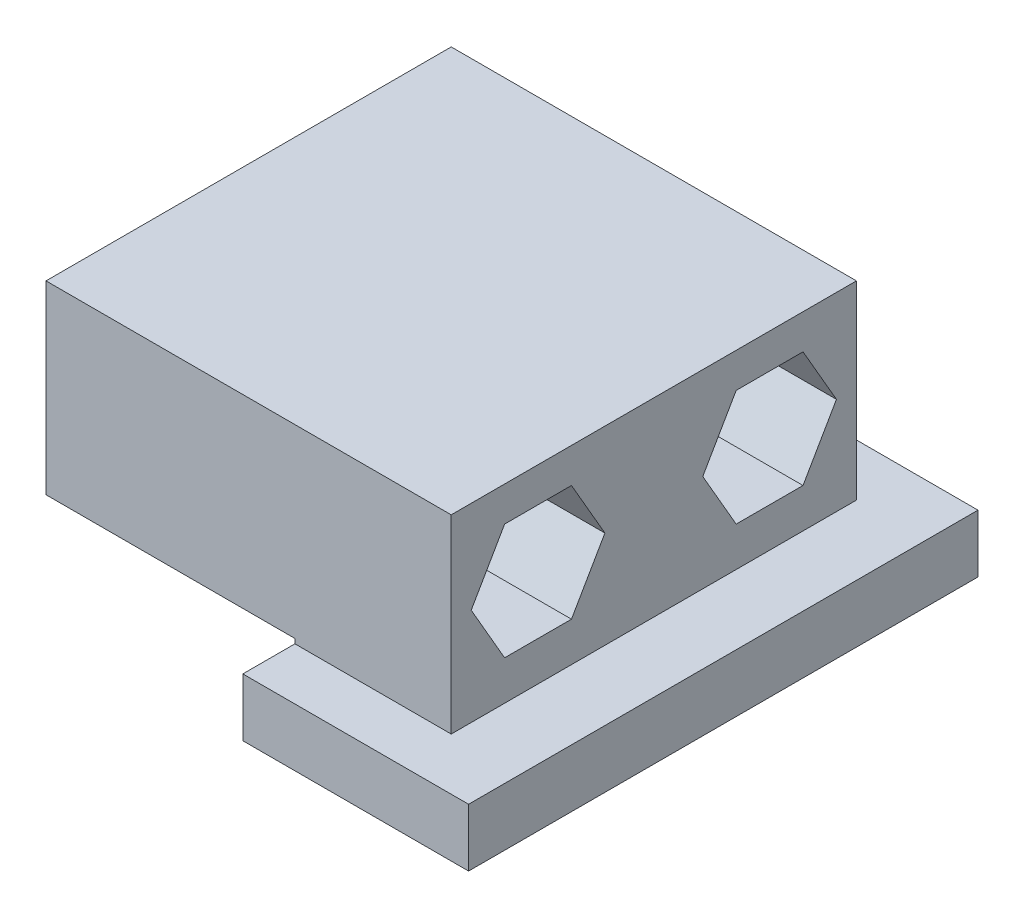
ISO-10303-21;
HEADER;
FILE_DESCRIPTION(('STEP AP214'),'2;1');
FILE_NAME('part.step','',(''),(''),'','','');
FILE_SCHEMA(('AUTOMOTIVE_DESIGN { 1 0 10303 214 1 1 1 1 }'));
ENDSEC;
DATA;
#1=APPLICATION_CONTEXT('core data for automotive mechanical design processes');
#2=APPLICATION_PROTOCOL_DEFINITION('international standard','automotive_design',2000,#1);
#3=PRODUCT_CONTEXT('',#1,'mechanical');
#4=PRODUCT('Part','Part','',(#3));
#5=PRODUCT_RELATED_PRODUCT_CATEGORY('part','',(#4));
#6=PRODUCT_DEFINITION_FORMATION('','',#4);
#7=PRODUCT_DEFINITION_CONTEXT('part definition',#1,'design');
#8=PRODUCT_DEFINITION('design','',#6,#7);
#9=PRODUCT_DEFINITION_SHAPE('','',#8);
#10=(LENGTH_UNIT() NAMED_UNIT(*) SI_UNIT(.MILLI.,.METRE.));
#11=(NAMED_UNIT(*) PLANE_ANGLE_UNIT() SI_UNIT($,.RADIAN.));
#12=(NAMED_UNIT(*) SI_UNIT($,.STERADIAN.) SOLID_ANGLE_UNIT());
#13=UNCERTAINTY_MEASURE_WITH_UNIT(LENGTH_MEASURE(1.E-05),#10,'distance_accuracy_value','');
#14=(GEOMETRIC_REPRESENTATION_CONTEXT(3) GLOBAL_UNCERTAINTY_ASSIGNED_CONTEXT((#13)) GLOBAL_UNIT_ASSIGNED_CONTEXT((#10,
#11,#12)) REPRESENTATION_CONTEXT('',''));
#15=CARTESIAN_POINT('',(0.,0.,0.));
#16=DIRECTION('',(0.,0.,1.));
#17=DIRECTION('',(1.,0.,0.));
#18=AXIS2_PLACEMENT_3D('',#15,#16,#17);
#19=CARTESIAN_POINT('',(-8.75,4.,-5.));
#20=DIRECTION('',(1.,0.,0.));
#21=DIRECTION('',(0.,0.,-1.));
#22=AXIS2_PLACEMENT_3D('',#19,#20,#21);
#23=CYLINDRICAL_SURFACE('',#22,1.35);
#24=CARTESIAN_POINT('',(-8.75,4.,-5.));
#25=DIRECTION('',(1.,0.,0.));
#26=DIRECTION('',(0.,0.,-1.));
#27=AXIS2_PLACEMENT_3D('',#24,#25,#26);
#28=CIRCLE('',#27,1.35);
#29=CARTESIAN_POINT('',(-8.75,4.,-6.35));
#30=VERTEX_POINT('',#29);
#31=EDGE_CURVE('E328',#30,#30,#28,.T.);
#32=ORIENTED_EDGE('',*,*,#31,.F.);
#33=EDGE_LOOP('',(#32));
#34=FACE_BOUND('',#33,.T.);
#35=CARTESIAN_POINT('',(4.75,4.,-5.));
#36=DIRECTION('',(1.,0.,0.));
#37=DIRECTION('',(0.,0.,-1.));
#38=AXIS2_PLACEMENT_3D('',#35,#36,#37);
#39=CIRCLE('',#38,1.35);
#40=CARTESIAN_POINT('',(4.75,4.,-6.35));
#41=VERTEX_POINT('',#40);
#42=EDGE_CURVE('E272',#41,#41,#39,.F.);
#43=ORIENTED_EDGE('',*,*,#42,.F.);
#44=EDGE_LOOP('',(#43));
#45=FACE_BOUND('',#44,.T.);
#46=ADVANCED_FACE('F35',(#34,#45),#23,.F.);
#47=CARTESIAN_POINT('',(8.75,8.,8.75));
#48=DIRECTION('',(-1.,0.,0.));
#49=DIRECTION('',(0.,0.,1.));
#50=AXIS2_PLACEMENT_3D('',#47,#48,#49);
#51=PLANE('',#50);
#52=DIRECTION('',(0.,0.86602540378444,0.499999999999998));
#53=VECTOR('',#52,1.);
#54=CARTESIAN_POINT('',(8.75,3.99999999999999,-7.88675134594813));
#55=LINE('',#54,#53);
#56=CARTESIAN_POINT('',(8.75,3.99999999999999,-7.88675134594813));
#57=VERTEX_POINT('',#56);
#58=CARTESIAN_POINT('',(8.75,6.5,-6.44337567297407));
#59=VERTEX_POINT('',#58);
#60=EDGE_CURVE('E255',#57,#59,#55,.T.);
#61=ORIENTED_EDGE('',*,*,#60,.F.);
#62=DIRECTION('',(0.,0.866025403784439,-0.499999999999999));
#63=VECTOR('',#62,1.);
#64=CARTESIAN_POINT('',(8.75,1.5,-6.44337567297407));
#65=LINE('',#64,#63);
#66=CARTESIAN_POINT('',(8.75,1.5,-6.44337567297407));
#67=VERTEX_POINT('',#66);
#68=EDGE_CURVE('E60',#67,#57,#65,.T.);
#69=ORIENTED_EDGE('',*,*,#68,.F.);
#70=DIRECTION('',(0.,0.,-1.));
#71=VECTOR('',#70,1.);
#72=CARTESIAN_POINT('',(8.75,1.5,-3.55662432702593));
#73=LINE('',#72,#71);
#74=CARTESIAN_POINT('',(8.75,1.5,-3.55662432702593));
#75=VERTEX_POINT('',#74);
#76=EDGE_CURVE('E238',#75,#67,#73,.T.);
#77=ORIENTED_EDGE('',*,*,#76,.F.);
#78=DIRECTION('',(0.,-0.866025403784439,-0.499999999999999));
#79=VECTOR('',#78,1.);
#80=CARTESIAN_POINT('',(8.75,4.,-2.11324865405187));
#81=LINE('',#80,#79);
#82=CARTESIAN_POINT('',(8.75,4.,-2.11324865405187));
#83=VERTEX_POINT('',#82);
#84=EDGE_CURVE('E265',#83,#75,#81,.T.);
#85=ORIENTED_EDGE('',*,*,#84,.F.);
#86=DIRECTION('',(0.,-0.866025403784439,0.5));
#87=VECTOR('',#86,1.);
#88=CARTESIAN_POINT('',(8.75,6.5,-3.55662432702594));
#89=LINE('',#88,#87);
#90=CARTESIAN_POINT('',(8.75,6.5,-3.55662432702594));
#91=VERTEX_POINT('',#90);
#92=EDGE_CURVE('E262',#91,#83,#89,.T.);
#93=ORIENTED_EDGE('',*,*,#92,.F.);
#94=DIRECTION('',(0.,0.,1.));
#95=VECTOR('',#94,1.);
#96=CARTESIAN_POINT('',(8.75,6.5,-6.44337567297407));
#97=LINE('',#96,#95);
#98=EDGE_CURVE('E259',#59,#91,#97,.T.);
#99=ORIENTED_EDGE('',*,*,#98,.F.);
#100=EDGE_LOOP('',(#61,#69,#77,#85,#93,#99));
#101=FACE_BOUND('',#100,.T.);
#102=DIRECTION('',(0.,0.866025403784439,-0.499999999999999));
#103=VECTOR('',#102,1.);
#104=CARTESIAN_POINT('',(8.75,4.,2.11324865405187));
#105=LINE('',#104,#103);
#106=CARTESIAN_POINT('',(8.75,1.5,3.55662432702593));
#107=VERTEX_POINT('',#106);
#108=CARTESIAN_POINT('',(8.75,4.,2.11324865405187));
#109=VERTEX_POINT('',#108);
#110=EDGE_CURVE('E303',#107,#109,#105,.T.);
#111=ORIENTED_EDGE('',*,*,#110,.F.);
#112=DIRECTION('',(0.,0.,-1.));
#113=VECTOR('',#112,1.);
#114=CARTESIAN_POINT('',(8.75,1.5,3.55662432702593));
#115=LINE('',#114,#113);
#116=CARTESIAN_POINT('',(8.75,1.5,6.44337567297407));
#117=VERTEX_POINT('',#116);
#118=EDGE_CURVE('E233',#117,#107,#115,.T.);
#119=ORIENTED_EDGE('',*,*,#118,.F.);
#120=DIRECTION('',(0.,-0.866025403784439,-0.5));
#121=VECTOR('',#120,1.);
#122=CARTESIAN_POINT('',(8.75,1.5,6.44337567297407));
#123=LINE('',#122,#121);
#124=CARTESIAN_POINT('',(8.75,3.99999999999999,7.88675134594813));
#125=VERTEX_POINT('',#124);
#126=EDGE_CURVE('E286',#125,#117,#123,.T.);
#127=ORIENTED_EDGE('',*,*,#126,.F.);
#128=DIRECTION('',(0.,-0.866025403784439,0.499999999999999));
#129=VECTOR('',#128,1.);
#130=CARTESIAN_POINT('',(8.75,3.99999999999999,7.88675134594813));
#131=LINE('',#130,#129);
#132=CARTESIAN_POINT('',(8.75,6.5,6.44337567297406));
#133=VERTEX_POINT('',#132);
#134=EDGE_CURVE('E312',#133,#125,#131,.T.);
#135=ORIENTED_EDGE('',*,*,#134,.F.);
#136=DIRECTION('',(0.,0.,1.));
#137=VECTOR('',#136,1.);
#138=CARTESIAN_POINT('',(8.75,6.5,6.44337567297406));
#139=LINE('',#138,#137);
#140=CARTESIAN_POINT('',(8.75,6.5,3.55662432702593));
#141=VERTEX_POINT('',#140);
#142=EDGE_CURVE('E309',#141,#133,#139,.T.);
#143=ORIENTED_EDGE('',*,*,#142,.F.);
#144=DIRECTION('',(0.,0.866025403784439,0.5));
#145=VECTOR('',#144,1.);
#146=CARTESIAN_POINT('',(8.75,6.5,3.55662432702593));
#147=LINE('',#146,#145);
#148=EDGE_CURVE('E306',#109,#141,#147,.T.);
#149=ORIENTED_EDGE('',*,*,#148,.F.);
#150=EDGE_LOOP('',(#111,#119,#127,#135,#143,#149));
#151=FACE_BOUND('',#150,.T.);
#152=DIRECTION('',(0.,-1.,0.));
#153=VECTOR('',#152,1.);
#154=CARTESIAN_POINT('',(8.75,8.,8.75));
#155=LINE('',#154,#153);
#156=CARTESIAN_POINT('',(8.75,8.,8.75));
#157=VERTEX_POINT('',#156);
#158=CARTESIAN_POINT('',(8.75,-0.2,8.75));
#159=VERTEX_POINT('',#158);
#160=EDGE_CURVE('E345',#157,#159,#155,.T.);
#161=ORIENTED_EDGE('',*,*,#160,.T.);
#162=DIRECTION('',(0.,0.,1.));
#163=VECTOR('',#162,1.);
#164=CARTESIAN_POINT('',(8.75,-0.2,-8.75));
#165=LINE('',#164,#163);
#166=CARTESIAN_POINT('',(8.75,-0.2,-8.75));
#167=VERTEX_POINT('',#166);
#168=EDGE_CURVE('E213',#167,#159,#165,.T.);
#169=ORIENTED_EDGE('',*,*,#168,.F.);
#170=DIRECTION('',(0.,-1.,0.));
#171=VECTOR('',#170,1.);
#172=CARTESIAN_POINT('',(8.75,8.,-8.75));
#173=LINE('',#172,#171);
#174=CARTESIAN_POINT('',(8.75,8.,-8.75));
#175=VERTEX_POINT('',#174);
#176=EDGE_CURVE('E12',#175,#167,#173,.T.);
#177=ORIENTED_EDGE('',*,*,#176,.F.);
#178=DIRECTION('',(0.,0.,-1.));
#179=VECTOR('',#178,1.);
#180=CARTESIAN_POINT('',(8.75,8.,8.75));
#181=LINE('',#180,#179);
#182=EDGE_CURVE('E335',#157,#175,#181,.T.);
#183=ORIENTED_EDGE('',*,*,#182,.F.);
#184=EDGE_LOOP('',(#161,#169,#177,#183));
#185=FACE_BOUND('',#184,.T.);
#186=ADVANCED_FACE('F37',(#101,#151,#185),#51,.F.);
#187=CARTESIAN_POINT('',(-8.75,8.,-8.75));
#188=DIRECTION('',(0.,0.,1.));
#189=DIRECTION('',(1.,0.,0.));
#190=AXIS2_PLACEMENT_3D('',#187,#188,#189);
#191=PLANE('',#190);
#192=ORIENTED_EDGE('',*,*,#176,.T.);
#193=DIRECTION('',(1.,0.,0.));
#194=VECTOR('',#193,1.);
#195=CARTESIAN_POINT('',(8.75,-0.2,-8.75));
#196=LINE('',#195,#194);
#197=CARTESIAN_POINT('',(2.,-0.2,-8.75));
#198=VERTEX_POINT('',#197);
#199=EDGE_CURVE('E224',#198,#167,#196,.T.);
#200=ORIENTED_EDGE('',*,*,#199,.F.);
#201=DIRECTION('',(0.,1.,0.));
#202=VECTOR('',#201,1.);
#203=CARTESIAN_POINT('',(2.,-0.2,-8.75));
#204=LINE('',#203,#202);
#205=CARTESIAN_POINT('',(2.,0.,-8.75));
#206=VERTEX_POINT('',#205);
#207=EDGE_CURVE('E226',#198,#206,#204,.T.);
#208=ORIENTED_EDGE('',*,*,#207,.T.);
#209=DIRECTION('',(-1.,0.,0.));
#210=VECTOR('',#209,1.);
#211=CARTESIAN_POINT('',(-8.75,0.,-8.75));
#212=LINE('',#211,#210);
#213=CARTESIAN_POINT('',(-8.75,0.,-8.75));
#214=VERTEX_POINT('',#213);
#215=EDGE_CURVE('E331',#206,#214,#212,.T.);
#216=ORIENTED_EDGE('',*,*,#215,.T.);
#217=DIRECTION('',(0.,-1.,0.));
#218=VECTOR('',#217,1.);
#219=CARTESIAN_POINT('',(-8.75,8.,-8.75));
#220=LINE('',#219,#218);
#221=CARTESIAN_POINT('',(-8.75,8.,-8.75));
#222=VERTEX_POINT('',#221);
#223=EDGE_CURVE('E44',#222,#214,#220,.T.);
#224=ORIENTED_EDGE('',*,*,#223,.F.);
#225=DIRECTION('',(-1.,0.,0.));
#226=VECTOR('',#225,1.);
#227=CARTESIAN_POINT('',(-8.75,8.,-8.75));
#228=LINE('',#227,#226);
#229=EDGE_CURVE('E338',#175,#222,#228,.T.);
#230=ORIENTED_EDGE('',*,*,#229,.F.);
#231=EDGE_LOOP('',(#192,#200,#208,#216,#224,#230));
#232=FACE_BOUND('',#231,.T.);
#233=ADVANCED_FACE('F388',(#232),#191,.F.);
#234=CARTESIAN_POINT('',(-8.75,8.,8.75));
#235=DIRECTION('',(1.,0.,0.));
#236=DIRECTION('',(0.,0.,-1.));
#237=AXIS2_PLACEMENT_3D('',#234,#235,#236);
#238=PLANE('',#237);
#239=ORIENTED_EDGE('',*,*,#31,.T.);
#240=EDGE_LOOP('',(#239));
#241=FACE_BOUND('',#240,.T.);
#242=CARTESIAN_POINT('',(-8.75,4.,5.));
#243=DIRECTION('',(1.,0.,0.));
#244=DIRECTION('',(0.,0.,1.));
#245=AXIS2_PLACEMENT_3D('',#242,#243,#244);
#246=CIRCLE('',#245,1.35);
#247=CARTESIAN_POINT('',(-8.75,4.,6.35));
#248=VERTEX_POINT('',#247);
#249=EDGE_CURVE('E332',#248,#248,#246,.T.);
#250=ORIENTED_EDGE('',*,*,#249,.T.);
#251=EDGE_LOOP('',(#250));
#252=FACE_BOUND('',#251,.T.);
#253=DIRECTION('',(0.,0.,1.));
#254=VECTOR('',#253,1.);
#255=CARTESIAN_POINT('',(-8.75,0.,8.75));
#256=LINE('',#255,#254);
#257=CARTESIAN_POINT('',(-8.75,0.,8.75));
#258=VERTEX_POINT('',#257);
#259=EDGE_CURVE('E347',#214,#258,#256,.T.);
#260=ORIENTED_EDGE('',*,*,#259,.T.);
#261=DIRECTION('',(0.,-1.,0.));
#262=VECTOR('',#261,1.);
#263=CARTESIAN_POINT('',(-8.75,8.,8.75));
#264=LINE('',#263,#262);
#265=CARTESIAN_POINT('',(-8.75,8.,8.75));
#266=VERTEX_POINT('',#265);
#267=EDGE_CURVE('E351',#266,#258,#264,.T.);
#268=ORIENTED_EDGE('',*,*,#267,.F.);
#269=DIRECTION('',(0.,0.,1.));
#270=VECTOR('',#269,1.);
#271=CARTESIAN_POINT('',(-8.75,8.,8.75));
#272=LINE('',#271,#270);
#273=EDGE_CURVE('E341',#222,#266,#272,.T.);
#274=ORIENTED_EDGE('',*,*,#273,.F.);
#275=ORIENTED_EDGE('',*,*,#223,.T.);
#276=EDGE_LOOP('',(#260,#268,#274,#275));
#277=FACE_BOUND('',#276,.T.);
#278=ADVANCED_FACE('F407',(#241,#252,#277),#238,.F.);
#279=CARTESIAN_POINT('',(-8.75,8.,8.75));
#280=DIRECTION('',(0.,0.,-1.));
#281=DIRECTION('',(-1.,0.,0.));
#282=AXIS2_PLACEMENT_3D('',#279,#280,#281);
#283=PLANE('',#282);
#284=DIRECTION('',(1.,0.,0.));
#285=VECTOR('',#284,1.);
#286=CARTESIAN_POINT('',(-8.75,0.,8.75));
#287=LINE('',#286,#285);
#288=CARTESIAN_POINT('',(2.,0.,8.75));
#289=VERTEX_POINT('',#288);
#290=EDGE_CURVE('E339',#258,#289,#287,.T.);
#291=ORIENTED_EDGE('',*,*,#290,.T.);
#292=DIRECTION('',(0.,1.,0.));
#293=VECTOR('',#292,1.);
#294=CARTESIAN_POINT('',(2.,-0.2,8.75));
#295=LINE('',#294,#293);
#296=CARTESIAN_POINT('',(2.,-0.2,8.75));
#297=VERTEX_POINT('',#296);
#298=EDGE_CURVE('E230',#297,#289,#295,.T.);
#299=ORIENTED_EDGE('',*,*,#298,.F.);
#300=DIRECTION('',(-1.,0.,0.));
#301=VECTOR('',#300,1.);
#302=CARTESIAN_POINT('',(8.75,-0.2,8.75));
#303=LINE('',#302,#301);
#304=EDGE_CURVE('E221',#159,#297,#303,.T.);
#305=ORIENTED_EDGE('',*,*,#304,.F.);
#306=ORIENTED_EDGE('',*,*,#160,.F.);
#307=DIRECTION('',(1.,0.,0.));
#308=VECTOR('',#307,1.);
#309=CARTESIAN_POINT('',(-8.75,8.,8.75));
#310=LINE('',#309,#308);
#311=EDGE_CURVE('E343',#266,#157,#310,.T.);
#312=ORIENTED_EDGE('',*,*,#311,.F.);
#313=ORIENTED_EDGE('',*,*,#267,.T.);
#314=EDGE_LOOP('',(#291,#299,#305,#306,#312,#313));
#315=FACE_BOUND('',#314,.T.);
#316=ADVANCED_FACE('F401',(#315),#283,.F.);
#317=CARTESIAN_POINT('',(0.,8.,0.));
#318=DIRECTION('',(0.,-1.,0.));
#319=DIRECTION('',(0.,0.,-1.));
#320=AXIS2_PLACEMENT_3D('',#317,#318,#319);
#321=PLANE('',#320);
#322=ORIENTED_EDGE('',*,*,#182,.T.);
#323=ORIENTED_EDGE('',*,*,#229,.T.);
#324=ORIENTED_EDGE('',*,*,#273,.T.);
#325=ORIENTED_EDGE('',*,*,#311,.T.);
#326=EDGE_LOOP('',(#322,#323,#324,#325));
#327=FACE_BOUND('',#326,.T.);
#328=ADVANCED_FACE('F398',(#327),#321,.F.);
#329=CARTESIAN_POINT('',(0.,0.,0.));
#330=DIRECTION('',(0.,-1.,0.));
#331=DIRECTION('',(0.,0.,-1.));
#332=AXIS2_PLACEMENT_3D('',#329,#330,#331);
#333=PLANE('',#332);
#334=DIRECTION('',(0.,0.,-1.));
#335=VECTOR('',#334,1.);
#336=CARTESIAN_POINT('',(2.,0.,-8.75));
#337=LINE('',#336,#335);
#338=EDGE_CURVE('E52',#289,#206,#337,.T.);
#339=ORIENTED_EDGE('',*,*,#338,.F.);
#340=ORIENTED_EDGE('',*,*,#290,.F.);
#341=ORIENTED_EDGE('',*,*,#259,.F.);
#342=ORIENTED_EDGE('',*,*,#215,.F.);
#343=EDGE_LOOP('',(#339,#340,#341,#342));
#344=FACE_BOUND('',#343,.T.);
#345=ADVANCED_FACE('F397',(#344),#333,.T.);
#346=CARTESIAN_POINT('',(-8.75,4.,5.));
#347=DIRECTION('',(1.,0.,0.));
#348=DIRECTION('',(0.,0.,-1.));
#349=AXIS2_PLACEMENT_3D('',#346,#347,#348);
#350=CYLINDRICAL_SURFACE('',#349,1.35);
#351=CARTESIAN_POINT('',(4.75,4.,5.));
#352=DIRECTION('',(-1.,0.,0.));
#353=DIRECTION('',(0.,0.,1.));
#354=AXIS2_PLACEMENT_3D('',#351,#352,#353);
#355=CIRCLE('',#354,1.35);
#356=CARTESIAN_POINT('',(4.75,4.,6.35));
#357=VERTEX_POINT('',#356);
#358=EDGE_CURVE('E39',#357,#357,#355,.F.);
#359=ORIENTED_EDGE('',*,*,#358,.T.);
#360=EDGE_LOOP('',(#359));
#361=FACE_BOUND('',#360,.T.);
#362=ORIENTED_EDGE('',*,*,#249,.F.);
#363=EDGE_LOOP('',(#362));
#364=FACE_BOUND('',#363,.T.);
#365=ADVANCED_FACE('F361',(#361,#364),#350,.F.);
#366=CARTESIAN_POINT('',(4.75,0.,0.));
#367=DIRECTION('',(1.,0.,0.));
#368=DIRECTION('',(0.,0.,-1.));
#369=AXIS2_PLACEMENT_3D('',#366,#367,#368);
#370=PLANE('',#369);
#371=DIRECTION('',(0.,0.866025403784439,-0.499999999999999));
#372=VECTOR('',#371,1.);
#373=CARTESIAN_POINT('',(4.75,1.5,-6.44337567297407));
#374=LINE('',#373,#372);
#375=CARTESIAN_POINT('',(4.75,1.5,-6.44337567297407));
#376=VERTEX_POINT('',#375);
#377=CARTESIAN_POINT('',(4.75,3.99999999999999,-7.88675134594813));
#378=VERTEX_POINT('',#377);
#379=EDGE_CURVE('E234',#376,#378,#374,.T.);
#380=ORIENTED_EDGE('',*,*,#379,.T.);
#381=DIRECTION('',(0.,0.86602540378444,0.499999999999998));
#382=VECTOR('',#381,1.);
#383=CARTESIAN_POINT('',(4.75,3.99999999999999,-7.88675134594813));
#384=LINE('',#383,#382);
#385=CARTESIAN_POINT('',(4.75,6.5,-6.44337567297407));
#386=VERTEX_POINT('',#385);
#387=EDGE_CURVE('E237',#378,#386,#384,.T.);
#388=ORIENTED_EDGE('',*,*,#387,.T.);
#389=DIRECTION('',(0.,0.,1.));
#390=VECTOR('',#389,1.);
#391=CARTESIAN_POINT('',(4.75,6.5,-6.44337567297407));
#392=LINE('',#391,#390);
#393=CARTESIAN_POINT('',(4.75,6.5,-3.55662432702594));
#394=VERTEX_POINT('',#393);
#395=EDGE_CURVE('E241',#386,#394,#392,.T.);
#396=ORIENTED_EDGE('',*,*,#395,.T.);
#397=DIRECTION('',(0.,-0.866025403784439,0.5));
#398=VECTOR('',#397,1.);
#399=CARTESIAN_POINT('',(4.75,6.5,-3.55662432702594));
#400=LINE('',#399,#398);
#401=CARTESIAN_POINT('',(4.75,4.,-2.11324865405187));
#402=VERTEX_POINT('',#401);
#403=EDGE_CURVE('E244',#394,#402,#400,.T.);
#404=ORIENTED_EDGE('',*,*,#403,.T.);
#405=DIRECTION('',(0.,-0.866025403784439,-0.499999999999999));
#406=VECTOR('',#405,1.);
#407=CARTESIAN_POINT('',(4.75,4.,-2.11324865405187));
#408=LINE('',#407,#406);
#409=CARTESIAN_POINT('',(4.75,1.5,-3.55662432702593));
#410=VERTEX_POINT('',#409);
#411=EDGE_CURVE('E247',#402,#410,#408,.T.);
#412=ORIENTED_EDGE('',*,*,#411,.T.);
#413=DIRECTION('',(0.,0.,-1.));
#414=VECTOR('',#413,1.);
#415=CARTESIAN_POINT('',(4.75,1.5,-3.55662432702593));
#416=LINE('',#415,#414);
#417=EDGE_CURVE('E250',#410,#376,#416,.T.);
#418=ORIENTED_EDGE('',*,*,#417,.T.);
#419=EDGE_LOOP('',(#380,#388,#396,#404,#412,#418));
#420=FACE_BOUND('',#419,.T.);
#421=ORIENTED_EDGE('',*,*,#42,.T.);
#422=EDGE_LOOP('',(#421));
#423=FACE_BOUND('',#422,.T.);
#424=ADVANCED_FACE('F396',(#420,#423),#370,.T.);
#425=CARTESIAN_POINT('',(4.75,1.5,-6.44337567297407));
#426=DIRECTION('',(0.,-0.499999999999999,-0.866025403784439));
#427=DIRECTION('',(0.,0.866025403784439,-0.499999999999999));
#428=AXIS2_PLACEMENT_3D('',#425,#426,#427);
#429=PLANE('',#428);
#430=ORIENTED_EDGE('',*,*,#68,.T.);
#431=DIRECTION('',(1.,0.,0.));
#432=VECTOR('',#431,1.);
#433=CARTESIAN_POINT('',(4.75,3.99999999999999,-7.88675134594813));
#434=LINE('',#433,#432);
#435=EDGE_CURVE('E253',#378,#57,#434,.T.);
#436=ORIENTED_EDGE('',*,*,#435,.F.);
#437=ORIENTED_EDGE('',*,*,#379,.F.);
#438=DIRECTION('',(1.,0.,0.));
#439=VECTOR('',#438,1.);
#440=CARTESIAN_POINT('',(4.75,1.5,-6.44337567297407));
#441=LINE('',#440,#439);
#442=EDGE_CURVE('E270',#376,#67,#441,.T.);
#443=ORIENTED_EDGE('',*,*,#442,.T.);
#444=EDGE_LOOP('',(#430,#436,#437,#443));
#445=FACE_BOUND('',#444,.T.);
#446=ADVANCED_FACE('F465',(#445),#429,.F.);
#447=CARTESIAN_POINT('',(4.75,1.5,-3.55662432702593));
#448=DIRECTION('',(0.,-1.,0.));
#449=DIRECTION('',(0.,0.,-1.));
#450=AXIS2_PLACEMENT_3D('',#447,#448,#449);
#451=PLANE('',#450);
#452=ORIENTED_EDGE('',*,*,#76,.T.);
#453=ORIENTED_EDGE('',*,*,#442,.F.);
#454=ORIENTED_EDGE('',*,*,#417,.F.);
#455=DIRECTION('',(1.,0.,0.));
#456=VECTOR('',#455,1.);
#457=CARTESIAN_POINT('',(4.75,1.5,-3.55662432702593));
#458=LINE('',#457,#456);
#459=EDGE_CURVE('E273',#410,#75,#458,.T.);
#460=ORIENTED_EDGE('',*,*,#459,.T.);
#461=EDGE_LOOP('',(#452,#453,#454,#460));
#462=FACE_BOUND('',#461,.T.);
#463=ADVANCED_FACE('F467',(#462),#451,.F.);
#464=CARTESIAN_POINT('',(4.75,4.,-2.11324865405187));
#465=DIRECTION('',(0.,-0.499999999999999,0.866025403784439));
#466=DIRECTION('',(0.,-0.866025403784439,-0.499999999999999));
#467=AXIS2_PLACEMENT_3D('',#464,#465,#466);
#468=PLANE('',#467);
#469=ORIENTED_EDGE('',*,*,#84,.T.);
#470=ORIENTED_EDGE('',*,*,#459,.F.);
#471=ORIENTED_EDGE('',*,*,#411,.F.);
#472=DIRECTION('',(1.,0.,0.));
#473=VECTOR('',#472,1.);
#474=CARTESIAN_POINT('',(4.75,4.,-2.11324865405187));
#475=LINE('',#474,#473);
#476=EDGE_CURVE('E275',#402,#83,#475,.T.);
#477=ORIENTED_EDGE('',*,*,#476,.T.);
#478=EDGE_LOOP('',(#469,#470,#471,#477));
#479=FACE_BOUND('',#478,.T.);
#480=ADVANCED_FACE('F470',(#479),#468,.F.);
#481=CARTESIAN_POINT('',(4.75,6.5,-3.55662432702594));
#482=DIRECTION('',(0.,0.5,0.866025403784439));
#483=DIRECTION('',(0.,-0.866025403784439,0.5));
#484=AXIS2_PLACEMENT_3D('',#481,#482,#483);
#485=PLANE('',#484);
#486=ORIENTED_EDGE('',*,*,#92,.T.);
#487=ORIENTED_EDGE('',*,*,#476,.F.);
#488=ORIENTED_EDGE('',*,*,#403,.F.);
#489=DIRECTION('',(1.,0.,0.));
#490=VECTOR('',#489,1.);
#491=CARTESIAN_POINT('',(4.75,6.5,-3.55662432702594));
#492=LINE('',#491,#490);
#493=EDGE_CURVE('E277',#394,#91,#492,.T.);
#494=ORIENTED_EDGE('',*,*,#493,.T.);
#495=EDGE_LOOP('',(#486,#487,#488,#494));
#496=FACE_BOUND('',#495,.T.);
#497=ADVANCED_FACE('F474',(#496),#485,.F.);
#498=CARTESIAN_POINT('',(4.75,6.5,-6.44337567297407));
#499=DIRECTION('',(0.,1.,0.));
#500=DIRECTION('',(0.,0.,1.));
#501=AXIS2_PLACEMENT_3D('',#498,#499,#500);
#502=PLANE('',#501);
#503=ORIENTED_EDGE('',*,*,#98,.T.);
#504=ORIENTED_EDGE('',*,*,#493,.F.);
#505=ORIENTED_EDGE('',*,*,#395,.F.);
#506=DIRECTION('',(1.,0.,0.));
#507=VECTOR('',#506,1.);
#508=CARTESIAN_POINT('',(4.75,6.5,-6.44337567297407));
#509=LINE('',#508,#507);
#510=EDGE_CURVE('E279',#386,#59,#509,.T.);
#511=ORIENTED_EDGE('',*,*,#510,.T.);
#512=EDGE_LOOP('',(#503,#504,#505,#511));
#513=FACE_BOUND('',#512,.T.);
#514=ADVANCED_FACE('F377',(#513),#502,.F.);
#515=CARTESIAN_POINT('',(4.75,3.99999999999999,-7.88675134594813));
#516=DIRECTION('',(0.,0.499999999999998,-0.86602540378444));
#517=DIRECTION('',(0.,0.86602540378444,0.499999999999998));
#518=AXIS2_PLACEMENT_3D('',#515,#516,#517);
#519=PLANE('',#518);
#520=ORIENTED_EDGE('',*,*,#60,.T.);
#521=ORIENTED_EDGE('',*,*,#510,.F.);
#522=ORIENTED_EDGE('',*,*,#387,.F.);
#523=ORIENTED_EDGE('',*,*,#435,.T.);
#524=EDGE_LOOP('',(#520,#521,#522,#523));
#525=FACE_BOUND('',#524,.T.);
#526=ADVANCED_FACE('F367',(#525),#519,.F.);
#527=CARTESIAN_POINT('',(4.75,0.,0.));
#528=DIRECTION('',(-1.,0.,0.));
#529=DIRECTION('',(0.,0.,1.));
#530=AXIS2_PLACEMENT_3D('',#527,#528,#529);
#531=PLANE('',#530);
#532=DIRECTION('',(0.,0.,-1.));
#533=VECTOR('',#532,1.);
#534=CARTESIAN_POINT('',(4.75,1.5,3.55662432702593));
#535=LINE('',#534,#533);
#536=CARTESIAN_POINT('',(4.75,1.5,6.44337567297407));
#537=VERTEX_POINT('',#536);
#538=CARTESIAN_POINT('',(4.75,1.5,3.55662432702593));
#539=VERTEX_POINT('',#538);
#540=EDGE_CURVE('E282',#537,#539,#535,.T.);
#541=ORIENTED_EDGE('',*,*,#540,.T.);
#542=DIRECTION('',(0.,0.866025403784439,-0.499999999999999));
#543=VECTOR('',#542,1.);
#544=CARTESIAN_POINT('',(4.75,4.,2.11324865405187));
#545=LINE('',#544,#543);
#546=CARTESIAN_POINT('',(4.75,4.,2.11324865405187));
#547=VERTEX_POINT('',#546);
#548=EDGE_CURVE('E285',#539,#547,#545,.T.);
#549=ORIENTED_EDGE('',*,*,#548,.T.);
#550=DIRECTION('',(0.,0.866025403784439,0.5));
#551=VECTOR('',#550,1.);
#552=CARTESIAN_POINT('',(4.75,6.5,3.55662432702593));
#553=LINE('',#552,#551);
#554=CARTESIAN_POINT('',(4.75,6.5,3.55662432702593));
#555=VERTEX_POINT('',#554);
#556=EDGE_CURVE('E289',#547,#555,#553,.T.);
#557=ORIENTED_EDGE('',*,*,#556,.T.);
#558=DIRECTION('',(0.,0.,1.));
#559=VECTOR('',#558,1.);
#560=CARTESIAN_POINT('',(4.75,6.5,6.44337567297406));
#561=LINE('',#560,#559);
#562=CARTESIAN_POINT('',(4.75,6.5,6.44337567297406));
#563=VERTEX_POINT('',#562);
#564=EDGE_CURVE('E292',#555,#563,#561,.T.);
#565=ORIENTED_EDGE('',*,*,#564,.T.);
#566=DIRECTION('',(0.,-0.866025403784439,0.499999999999999));
#567=VECTOR('',#566,1.);
#568=CARTESIAN_POINT('',(4.75,3.99999999999999,7.88675134594813));
#569=LINE('',#568,#567);
#570=CARTESIAN_POINT('',(4.75,3.99999999999999,7.88675134594813));
#571=VERTEX_POINT('',#570);
#572=EDGE_CURVE('E295',#563,#571,#569,.T.);
#573=ORIENTED_EDGE('',*,*,#572,.T.);
#574=DIRECTION('',(0.,-0.866025403784439,-0.5));
#575=VECTOR('',#574,1.);
#576=CARTESIAN_POINT('',(4.75,1.5,6.44337567297407));
#577=LINE('',#576,#575);
#578=EDGE_CURVE('E298',#571,#537,#577,.T.);
#579=ORIENTED_EDGE('',*,*,#578,.T.);
#580=EDGE_LOOP('',(#541,#549,#557,#565,#573,#579));
#581=FACE_BOUND('',#580,.T.);
#582=ORIENTED_EDGE('',*,*,#358,.F.);
#583=EDGE_LOOP('',(#582));
#584=FACE_BOUND('',#583,.T.);
#585=ADVANCED_FACE('F364',(#581,#584),#531,.F.);
#586=CARTESIAN_POINT('',(4.75,1.5,3.55662432702593));
#587=DIRECTION('',(0.,-1.,0.));
#588=DIRECTION('',(0.,0.,-1.));
#589=AXIS2_PLACEMENT_3D('',#586,#587,#588);
#590=PLANE('',#589);
#591=ORIENTED_EDGE('',*,*,#118,.T.);
#592=DIRECTION('',(1.,0.,0.));
#593=VECTOR('',#592,1.);
#594=CARTESIAN_POINT('',(4.75,1.5,3.55662432702593));
#595=LINE('',#594,#593);
#596=EDGE_CURVE('E301',#539,#107,#595,.T.);
#597=ORIENTED_EDGE('',*,*,#596,.F.);
#598=ORIENTED_EDGE('',*,*,#540,.F.);
#599=DIRECTION('',(1.,0.,0.));
#600=VECTOR('',#599,1.);
#601=CARTESIAN_POINT('',(4.75,1.5,6.44337567297407));
#602=LINE('',#601,#600);
#603=EDGE_CURVE('E256',#537,#117,#602,.T.);
#604=ORIENTED_EDGE('',*,*,#603,.T.);
#605=EDGE_LOOP('',(#591,#597,#598,#604));
#606=FACE_BOUND('',#605,.T.);
#607=ADVANCED_FACE('F366',(#606),#590,.F.);
#608=CARTESIAN_POINT('',(4.75,1.5,6.44337567297407));
#609=DIRECTION('',(0.,-0.5,0.866025403784439));
#610=DIRECTION('',(0.,-0.866025403784439,-0.5));
#611=AXIS2_PLACEMENT_3D('',#608,#609,#610);
#612=PLANE('',#611);
#613=ORIENTED_EDGE('',*,*,#126,.T.);
#614=ORIENTED_EDGE('',*,*,#603,.F.);
#615=ORIENTED_EDGE('',*,*,#578,.F.);
#616=DIRECTION('',(1.,0.,0.));
#617=VECTOR('',#616,1.);
#618=CARTESIAN_POINT('',(4.75,3.99999999999999,7.88675134594813));
#619=LINE('',#618,#617);
#620=EDGE_CURVE('E318',#571,#125,#619,.T.);
#621=ORIENTED_EDGE('',*,*,#620,.T.);
#622=EDGE_LOOP('',(#613,#614,#615,#621));
#623=FACE_BOUND('',#622,.T.);
#624=ADVANCED_FACE('F374',(#623),#612,.F.);
#625=CARTESIAN_POINT('',(4.75,3.99999999999999,7.88675134594813));
#626=DIRECTION('',(0.,0.499999999999999,0.86602540378444));
#627=DIRECTION('',(0.,-0.866025403784439,0.499999999999999));
#628=AXIS2_PLACEMENT_3D('',#625,#626,#627);
#629=PLANE('',#628);
#630=ORIENTED_EDGE('',*,*,#134,.T.);
#631=ORIENTED_EDGE('',*,*,#620,.F.);
#632=ORIENTED_EDGE('',*,*,#572,.F.);
#633=DIRECTION('',(1.,0.,0.));
#634=VECTOR('',#633,1.);
#635=CARTESIAN_POINT('',(4.75,6.5,6.44337567297406));
#636=LINE('',#635,#634);
#637=EDGE_CURVE('E320',#563,#133,#636,.T.);
#638=ORIENTED_EDGE('',*,*,#637,.T.);
#639=EDGE_LOOP('',(#630,#631,#632,#638));
#640=FACE_BOUND('',#639,.T.);
#641=ADVANCED_FACE('F525',(#640),#629,.F.);
#642=CARTESIAN_POINT('',(4.75,6.5,6.44337567297406));
#643=DIRECTION('',(0.,1.,0.));
#644=DIRECTION('',(0.,0.,1.));
#645=AXIS2_PLACEMENT_3D('',#642,#643,#644);
#646=PLANE('',#645);
#647=ORIENTED_EDGE('',*,*,#142,.T.);
#648=ORIENTED_EDGE('',*,*,#637,.F.);
#649=ORIENTED_EDGE('',*,*,#564,.F.);
#650=DIRECTION('',(1.,0.,0.));
#651=VECTOR('',#650,1.);
#652=CARTESIAN_POINT('',(4.75,6.5,3.55662432702593));
#653=LINE('',#652,#651);
#654=EDGE_CURVE('E322',#555,#141,#653,.T.);
#655=ORIENTED_EDGE('',*,*,#654,.T.);
#656=EDGE_LOOP('',(#647,#648,#649,#655));
#657=FACE_BOUND('',#656,.T.);
#658=ADVANCED_FACE('F534',(#657),#646,.F.);
#659=CARTESIAN_POINT('',(4.75,6.5,3.55662432702593));
#660=DIRECTION('',(0.,0.5,-0.866025403784439));
#661=DIRECTION('',(0.,0.866025403784439,0.5));
#662=AXIS2_PLACEMENT_3D('',#659,#660,#661);
#663=PLANE('',#662);
#664=ORIENTED_EDGE('',*,*,#148,.T.);
#665=ORIENTED_EDGE('',*,*,#654,.F.);
#666=ORIENTED_EDGE('',*,*,#556,.F.);
#667=DIRECTION('',(1.,0.,0.));
#668=VECTOR('',#667,1.);
#669=CARTESIAN_POINT('',(4.75,4.,2.11324865405187));
#670=LINE('',#669,#668);
#671=EDGE_CURVE('E324',#547,#109,#670,.T.);
#672=ORIENTED_EDGE('',*,*,#671,.T.);
#673=EDGE_LOOP('',(#664,#665,#666,#672));
#674=FACE_BOUND('',#673,.T.);
#675=ADVANCED_FACE('F458',(#674),#663,.F.);
#676=CARTESIAN_POINT('',(4.75,4.,2.11324865405187));
#677=DIRECTION('',(0.,-0.499999999999999,-0.866025403784439));
#678=DIRECTION('',(0.,0.866025403784439,-0.499999999999999));
#679=AXIS2_PLACEMENT_3D('',#676,#677,#678);
#680=PLANE('',#679);
#681=ORIENTED_EDGE('',*,*,#110,.T.);
#682=ORIENTED_EDGE('',*,*,#671,.F.);
#683=ORIENTED_EDGE('',*,*,#548,.F.);
#684=ORIENTED_EDGE('',*,*,#596,.T.);
#685=EDGE_LOOP('',(#681,#682,#683,#684));
#686=FACE_BOUND('',#685,.T.);
#687=ADVANCED_FACE('F451',(#686),#680,.F.);
#688=CARTESIAN_POINT('',(2.,-0.2,-8.75));
#689=DIRECTION('',(1.,0.,0.));
#690=DIRECTION('',(0.,0.,-1.));
#691=AXIS2_PLACEMENT_3D('',#688,#689,#690);
#692=PLANE('',#691);
#693=ORIENTED_EDGE('',*,*,#338,.T.);
#694=ORIENTED_EDGE('',*,*,#207,.F.);
#695=DIRECTION('',(0.,0.,-1.));
#696=VECTOR('',#695,1.);
#697=CARTESIAN_POINT('',(2.,-0.2,-11.));
#698=LINE('',#697,#696);
#699=CARTESIAN_POINT('',(2.,-0.2,-11.));
#700=VERTEX_POINT('',#699);
#701=EDGE_CURVE('E424',#198,#700,#698,.T.);
#702=ORIENTED_EDGE('',*,*,#701,.T.);
#703=DIRECTION('',(0.,1.,0.));
#704=VECTOR('',#703,1.);
#705=CARTESIAN_POINT('',(2.,-2.7,-11.));
#706=LINE('',#705,#704);
#707=CARTESIAN_POINT('',(2.,-2.7,-11.));
#708=VERTEX_POINT('',#707);
#709=EDGE_CURVE('E215',#708,#700,#706,.T.);
#710=ORIENTED_EDGE('',*,*,#709,.F.);
#711=DIRECTION('',(0.,0.,-1.));
#712=VECTOR('',#711,1.);
#713=CARTESIAN_POINT('',(2.,-2.7,-11.));
#714=LINE('',#713,#712);
#715=CARTESIAN_POINT('',(2.,-2.7,11.));
#716=VERTEX_POINT('',#715);
#717=EDGE_CURVE('E197',#716,#708,#714,.T.);
#718=ORIENTED_EDGE('',*,*,#717,.F.);
#719=DIRECTION('',(0.,1.,0.));
#720=VECTOR('',#719,1.);
#721=CARTESIAN_POINT('',(2.,-2.7,11.));
#722=LINE('',#721,#720);
#723=CARTESIAN_POINT('',(2.,-0.2,11.));
#724=VERTEX_POINT('',#723);
#725=EDGE_CURVE('E194',#716,#724,#722,.T.);
#726=ORIENTED_EDGE('',*,*,#725,.T.);
#727=EDGE_CURVE('E428',#724,#297,#698,.T.);
#728=ORIENTED_EDGE('',*,*,#727,.T.);
#729=ORIENTED_EDGE('',*,*,#298,.T.);
#730=EDGE_LOOP('',(#693,#694,#702,#710,#718,#726,#728,#729));
#731=FACE_BOUND('',#730,.T.);
#732=ADVANCED_FACE('F439',(#731),#692,.F.);
#733=CARTESIAN_POINT('',(0.,-0.2,0.));
#734=DIRECTION('',(0.,-1.,0.));
#735=DIRECTION('',(0.,0.,-1.));
#736=AXIS2_PLACEMENT_3D('',#733,#734,#735);
#737=PLANE('',#736);
#738=ORIENTED_EDGE('',*,*,#168,.T.);
#739=ORIENTED_EDGE('',*,*,#304,.T.);
#740=ORIENTED_EDGE('',*,*,#727,.F.);
#741=DIRECTION('',(-1.,0.,0.));
#742=VECTOR('',#741,1.);
#743=CARTESIAN_POINT('',(11.75,-0.2,11.));
#744=LINE('',#743,#742);
#745=CARTESIAN_POINT('',(11.75,-0.2,11.));
#746=VERTEX_POINT('',#745);
#747=EDGE_CURVE('E429',#746,#724,#744,.T.);
#748=ORIENTED_EDGE('',*,*,#747,.F.);
#749=DIRECTION('',(0.,0.,1.));
#750=VECTOR('',#749,1.);
#751=CARTESIAN_POINT('',(11.75,-0.2,-11.));
#752=LINE('',#751,#750);
#753=CARTESIAN_POINT('',(11.75,-0.2,-11.));
#754=VERTEX_POINT('',#753);
#755=EDGE_CURVE('E211',#754,#746,#752,.T.);
#756=ORIENTED_EDGE('',*,*,#755,.F.);
#757=DIRECTION('',(1.,0.,0.));
#758=VECTOR('',#757,1.);
#759=CARTESIAN_POINT('',(11.75,-0.2,-11.));
#760=LINE('',#759,#758);
#761=EDGE_CURVE('E207',#700,#754,#760,.T.);
#762=ORIENTED_EDGE('',*,*,#761,.F.);
#763=ORIENTED_EDGE('',*,*,#701,.F.);
#764=ORIENTED_EDGE('',*,*,#199,.T.);
#765=EDGE_LOOP('',(#738,#739,#740,#748,#756,#762,#763,#764));
#766=FACE_BOUND('',#765,.T.);
#767=ADVANCED_FACE('F422',(#766),#737,.F.);
#768=CARTESIAN_POINT('',(11.75,-2.7,-11.));
#769=DIRECTION('',(-1.,0.,0.));
#770=DIRECTION('',(0.,0.,1.));
#771=AXIS2_PLACEMENT_3D('',#768,#769,#770);
#772=PLANE('',#771);
#773=ORIENTED_EDGE('',*,*,#755,.T.);
#774=DIRECTION('',(0.,1.,0.));
#775=VECTOR('',#774,1.);
#776=CARTESIAN_POINT('',(11.75,-2.7,11.));
#777=LINE('',#776,#775);
#778=CARTESIAN_POINT('',(11.75,-2.7,11.));
#779=VERTEX_POINT('',#778);
#780=EDGE_CURVE('E191',#779,#746,#777,.T.);
#781=ORIENTED_EDGE('',*,*,#780,.F.);
#782=DIRECTION('',(0.,0.,1.));
#783=VECTOR('',#782,1.);
#784=CARTESIAN_POINT('',(11.75,-2.7,-11.));
#785=LINE('',#784,#783);
#786=CARTESIAN_POINT('',(11.75,-2.7,-11.));
#787=VERTEX_POINT('',#786);
#788=EDGE_CURVE('E198',#787,#779,#785,.T.);
#789=ORIENTED_EDGE('',*,*,#788,.F.);
#790=DIRECTION('',(0.,1.,0.));
#791=VECTOR('',#790,1.);
#792=CARTESIAN_POINT('',(11.75,-2.7,-11.));
#793=LINE('',#792,#791);
#794=EDGE_CURVE('E436',#787,#754,#793,.T.);
#795=ORIENTED_EDGE('',*,*,#794,.T.);
#796=EDGE_LOOP('',(#773,#781,#789,#795));
#797=FACE_BOUND('',#796,.T.);
#798=ADVANCED_FACE('F209',(#797),#772,.F.);
#799=CARTESIAN_POINT('',(11.75,-2.7,11.));
#800=DIRECTION('',(0.,0.,-1.));
#801=DIRECTION('',(-1.,0.,0.));
#802=AXIS2_PLACEMENT_3D('',#799,#800,#801);
#803=PLANE('',#802);
#804=ORIENTED_EDGE('',*,*,#747,.T.);
#805=ORIENTED_EDGE('',*,*,#725,.F.);
#806=DIRECTION('',(-1.,0.,0.));
#807=VECTOR('',#806,1.);
#808=CARTESIAN_POINT('',(11.75,-2.7,11.));
#809=LINE('',#808,#807);
#810=EDGE_CURVE('E187',#779,#716,#809,.T.);
#811=ORIENTED_EDGE('',*,*,#810,.F.);
#812=ORIENTED_EDGE('',*,*,#780,.T.);
#813=EDGE_LOOP('',(#804,#805,#811,#812));
#814=FACE_BOUND('',#813,.T.);
#815=ADVANCED_FACE('F189',(#814),#803,.F.);
#816=CARTESIAN_POINT('',(11.75,-2.7,-11.));
#817=DIRECTION('',(0.,0.,1.));
#818=DIRECTION('',(1.,0.,0.));
#819=AXIS2_PLACEMENT_3D('',#816,#817,#818);
#820=PLANE('',#819);
#821=ORIENTED_EDGE('',*,*,#761,.T.);
#822=ORIENTED_EDGE('',*,*,#794,.F.);
#823=DIRECTION('',(1.,0.,0.));
#824=VECTOR('',#823,1.);
#825=CARTESIAN_POINT('',(11.75,-2.7,-11.));
#826=LINE('',#825,#824);
#827=EDGE_CURVE('E203',#708,#787,#826,.T.);
#828=ORIENTED_EDGE('',*,*,#827,.F.);
#829=ORIENTED_EDGE('',*,*,#709,.T.);
#830=EDGE_LOOP('',(#821,#822,#828,#829));
#831=FACE_BOUND('',#830,.T.);
#832=ADVANCED_FACE('F438',(#831),#820,.F.);
#833=CARTESIAN_POINT('',(0.,-2.7,0.));
#834=DIRECTION('',(0.,-1.,0.));
#835=DIRECTION('',(0.,0.,-1.));
#836=AXIS2_PLACEMENT_3D('',#833,#834,#835);
#837=PLANE('',#836);
#838=ORIENTED_EDGE('',*,*,#788,.T.);
#839=ORIENTED_EDGE('',*,*,#810,.T.);
#840=ORIENTED_EDGE('',*,*,#717,.T.);
#841=ORIENTED_EDGE('',*,*,#827,.T.);
#842=EDGE_LOOP('',(#838,#839,#840,#841));
#843=FACE_BOUND('',#842,.T.);
#844=ADVANCED_FACE('F201',(#843),#837,.T.);
#845=CLOSED_SHELL('',(#46,#186,#233,#278,#316,#328,#345,#365,#424,#446,#463,#480,#497,#514,#526,
#585,#607,#624,#641,#658,#675,#687,#732,#767,#798,#815,#832,#844));
#846=MANIFOLD_SOLID_BREP('B2',#845);
#847=ADVANCED_BREP_SHAPE_REPRESENTATION('',(#18,#846),#14);
#848=SHAPE_DEFINITION_REPRESENTATION(#9,#847);
ENDSEC;
END-ISO-10303-21;
